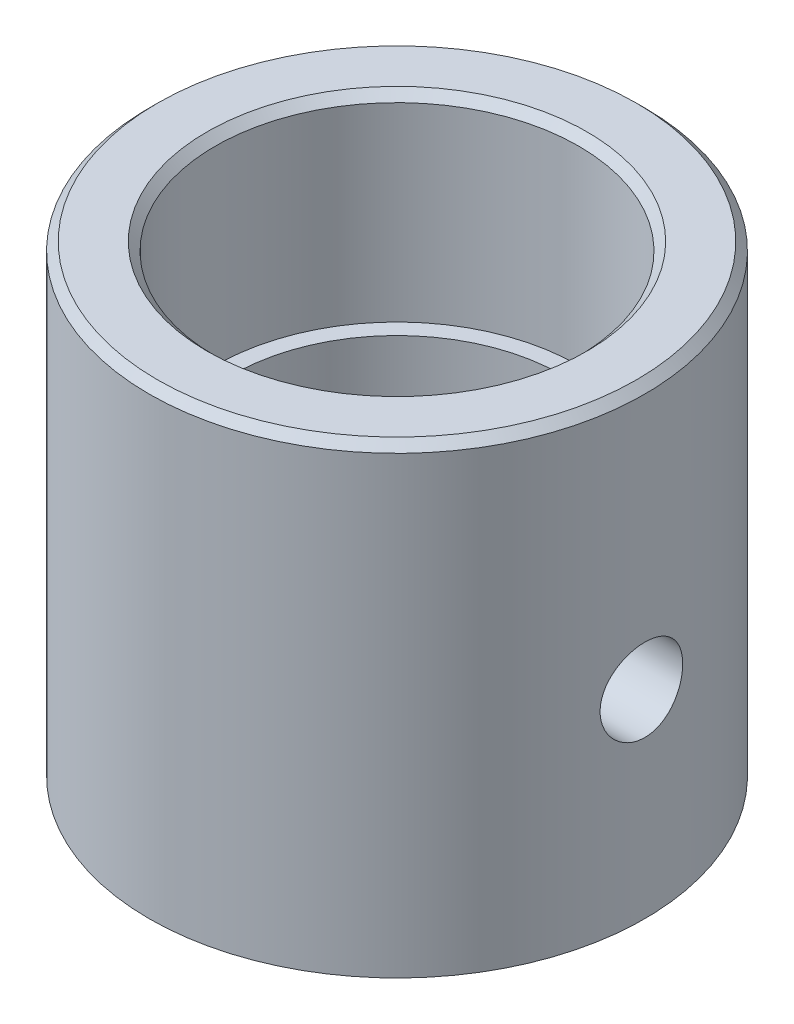
ISO-10303-21;
HEADER;
FILE_DESCRIPTION(('STEP AP214'),'2;1');
FILE_NAME('part.step','',(''),(''),'','','');
FILE_SCHEMA(('AUTOMOTIVE_DESIGN { 1 0 10303 214 1 1 1 1 }'));
ENDSEC;
DATA;
#1=APPLICATION_CONTEXT('core data for automotive mechanical design processes');
#2=APPLICATION_PROTOCOL_DEFINITION('international standard','automotive_design',2000,#1);
#3=PRODUCT_CONTEXT('',#1,'mechanical');
#4=PRODUCT('Part','Part','',(#3));
#5=PRODUCT_RELATED_PRODUCT_CATEGORY('part','',(#4));
#6=PRODUCT_DEFINITION_FORMATION('','',#4);
#7=PRODUCT_DEFINITION_CONTEXT('part definition',#1,'design');
#8=PRODUCT_DEFINITION('design','',#6,#7);
#9=PRODUCT_DEFINITION_SHAPE('','',#8);
#10=(LENGTH_UNIT() NAMED_UNIT(*) SI_UNIT(.MILLI.,.METRE.));
#11=(NAMED_UNIT(*) PLANE_ANGLE_UNIT() SI_UNIT($,.RADIAN.));
#12=(NAMED_UNIT(*) SI_UNIT($,.STERADIAN.) SOLID_ANGLE_UNIT());
#13=UNCERTAINTY_MEASURE_WITH_UNIT(LENGTH_MEASURE(1.E-05),#10,'distance_accuracy_value','');
#14=(GEOMETRIC_REPRESENTATION_CONTEXT(3) GLOBAL_UNCERTAINTY_ASSIGNED_CONTEXT((#13)) GLOBAL_UNIT_ASSIGNED_CONTEXT((#10,
#11,#12)) REPRESENTATION_CONTEXT('',''));
#15=CARTESIAN_POINT('',(0.,0.,0.));
#16=DIRECTION('',(0.,0.,1.));
#17=DIRECTION('',(1.,0.,0.));
#18=AXIS2_PLACEMENT_3D('',#15,#16,#17);
#19=CARTESIAN_POINT('',(0.,28.,0.));
#20=DIRECTION('',(0.,-1.,0.));
#21=DIRECTION('',(0.,0.,-1.));
#22=AXIS2_PLACEMENT_3D('',#19,#20,#21);
#23=CYLINDRICAL_SURFACE('',#22,15.);
#24=CARTESIAN_POINT('',(0.,27.5,0.));
#25=DIRECTION('',(0.,1.,0.));
#26=DIRECTION('',(0.,0.,1.));
#27=AXIS2_PLACEMENT_3D('',#24,#25,#26);
#28=CIRCLE('',#27,15.);
#29=CARTESIAN_POINT('',(0.,27.5,15.));
#30=VERTEX_POINT('',#29);
#31=EDGE_CURVE('E40',#30,#30,#28,.F.);
#32=ORIENTED_EDGE('',*,*,#31,.T.);
#33=EDGE_LOOP('',(#32));
#34=FACE_BOUND('',#33,.T.);
#35=CARTESIAN_POINT('',(-14.790199457749,12.,-2.5));
#36=CARTESIAN_POINT('',(-14.790201973666,12.1393757481618,-2.49999439841983));
#37=CARTESIAN_POINT('',(-14.7921909238523,12.2788276060715,-2.48830516902828));
#38=CARTESIAN_POINT('',(-14.7999245720004,12.5538185432632,-2.44187742806638));
#39=CARTESIAN_POINT('',(-14.8056727334637,12.6893538937581,-2.40711766030861));
#40=CARTESIAN_POINT('',(-14.8202560936731,12.9524922833416,-2.31562954367049));
#41=CARTESIAN_POINT('',(-14.8290887118401,13.0801018486622,-2.25891955493199));
#42=CARTESIAN_POINT('',(-14.8488427210228,13.3239809547178,-2.12518649688947));
#43=CARTESIAN_POINT('',(-14.8597638769423,13.4402517695773,-2.04816571350133));
#44=CARTESIAN_POINT('',(-14.8825847115588,13.6593128497446,-1.87518752696654));
#45=CARTESIAN_POINT('',(-14.8944921732795,13.7619751313862,-1.77906904893234));
#46=CARTESIAN_POINT('',(-14.9178748066858,13.9497933068618,-1.57097200469528));
#47=CARTESIAN_POINT('',(-14.9293499527174,14.0349481631154,-1.45899249914997));
#48=CARTESIAN_POINT('',(-14.9506573698271,14.1858145672193,-1.22152286994836));
#49=CARTESIAN_POINT('',(-14.9604794243234,14.2514070077318,-1.09595608145671));
#50=CARTESIAN_POINT('',(-14.9772873695709,14.3605210705306,-0.835395621723869));
#51=CARTESIAN_POINT('',(-14.9842734447266,14.4040441278849,-0.700402564078189));
#52=CARTESIAN_POINT('',(-14.994567347244,14.4673925349839,-0.426143726344243));
#53=CARTESIAN_POINT('',(-14.9979085311091,14.4874329160047,-0.286928886679271));
#54=CARTESIAN_POINT('',(-15.0006507934278,14.5039157541526,-0.00707528552579671));
#55=CARTESIAN_POINT('',(-15.0000521396931,14.5003598152472,0.133563378528899));
#56=CARTESIAN_POINT('',(-14.9950085843139,14.4699186484718,0.410802185078876));
#57=CARTESIAN_POINT('',(-14.990601836924,14.4432648365908,0.547428530700141));
#58=CARTESIAN_POINT('',(-14.9784797877164,14.3677489257535,0.814241979611791));
#59=CARTESIAN_POINT('',(-14.9707643851321,14.3188861504105,0.944428886651504));
#60=CARTESIAN_POINT('',(-14.9528269851196,14.2001093596847,1.19535614778265));
#61=CARTESIAN_POINT('',(-14.9425936732688,14.1300999879176,1.31605052301905));
#62=CARTESIAN_POINT('',(-14.920757380715,13.971087177365,1.54406552984664));
#63=CARTESIAN_POINT('',(-14.9091542891913,13.8820822012892,1.65138507791588));
#64=CARTESIAN_POINT('',(-14.885702682326,13.6863211933807,1.85097127344667));
#65=CARTESIAN_POINT('',(-14.8738528973104,13.579362905099,1.94303950225321));
#66=CARTESIAN_POINT('',(-14.8513795978481,13.3514129097842,2.10795458844807));
#67=CARTESIAN_POINT('',(-14.8407560947132,13.2304210733172,2.18080126853242));
#68=CARTESIAN_POINT('',(-14.8219375456182,12.9776083581225,2.30524443448829));
#69=CARTESIAN_POINT('',(-14.813745233026,12.8457755019079,2.35681702727924));
#70=CARTESIAN_POINT('',(-14.8007618868988,12.5751509276925,2.43702987081562));
#71=CARTESIAN_POINT('',(-14.7959705538832,12.4363598235676,2.46567214076796));
#72=CARTESIAN_POINT('',(-14.7903895942212,12.1575338438379,2.49893188487927));
#73=CARTESIAN_POINT('',(-14.7895528575867,12.0175336202979,2.50383220791244));
#74=CARTESIAN_POINT('',(-14.7918503478236,11.7387133283092,2.49022270268246));
#75=CARTESIAN_POINT('',(-14.7949844213185,11.599893214486,2.47171377862467));
#76=CARTESIAN_POINT('',(-14.8048268745502,11.3282722408091,2.4120523349281));
#77=CARTESIAN_POINT('',(-14.8115125191835,11.195438860122,2.37104379064639));
#78=CARTESIAN_POINT('',(-14.827685730055,10.9385298337205,2.26769819019228));
#79=CARTESIAN_POINT('',(-14.8371734639058,10.8144547124491,2.20535985810094));
#80=CARTESIAN_POINT('',(-14.8579912839739,10.5773254055939,2.06045667322923));
#81=CARTESIAN_POINT('',(-14.8693375560035,10.4643834272439,1.97771056415936));
#82=CARTESIAN_POINT('',(-14.8925466667987,10.253886467305,1.79458946570798));
#83=CARTESIAN_POINT('',(-14.9044095418533,10.1563325688903,1.69421323638404));
#84=CARTESIAN_POINT('',(-14.9274642211826,9.9783481072713,1.47742807032881));
#85=CARTESIAN_POINT('',(-14.9386477634467,9.89810617371546,1.3608632533862));
#86=CARTESIAN_POINT('',(-14.9589511243294,9.75834467299512,1.11574344794933));
#87=CARTESIAN_POINT('',(-14.9680710096998,9.69882443552615,0.987188847470627));
#88=CARTESIAN_POINT('',(-14.9831835816958,9.60248941604513,0.722299051501329));
#89=CARTESIAN_POINT('',(-14.9891898456762,9.56557592426508,0.586000562602612));
#90=CARTESIAN_POINT('',(-14.9974558316928,9.51518440103617,0.309030734874212));
#91=CARTESIAN_POINT('',(-14.9997158620019,9.50170444126765,0.168359756821621));
#92=CARTESIAN_POINT('',(-15.0002303788781,9.4986181176878,-0.111541275773676));
#93=CARTESIAN_POINT('',(-14.9985330202419,9.50872474605892,-0.250768160602664));
#94=CARTESIAN_POINT('',(-14.9914217838733,9.55190392226943,-0.525511974314705));
#95=CARTESIAN_POINT('',(-14.9860079269518,9.58497634150967,-0.661028923967479));
#96=CARTESIAN_POINT('',(-14.972069888274,9.67303816554365,-0.924396445918538));
#97=CARTESIAN_POINT('',(-14.9635491704088,9.72800316821005,-1.05225537215382));
#98=CARTESIAN_POINT('',(-14.9443275687803,9.85825793623058,-1.29698045298217));
#99=CARTESIAN_POINT('',(-14.9336265816741,9.93354866506245,-1.41384608611822));
#100=CARTESIAN_POINT('',(-14.9110762961641,10.1033350924605,-1.63471294552639));
#101=CARTESIAN_POINT('',(-14.8992152454112,10.1980409547513,-1.73855143060275));
#102=CARTESIAN_POINT('',(-14.8757630331437,10.4035283079038,-1.92896387595091));
#103=CARTESIAN_POINT('',(-14.8641719354951,10.5143135589125,-2.0155337867119));
#104=CARTESIAN_POINT('',(-14.8424834353391,10.7497453224896,-2.16951427091086));
#105=CARTESIAN_POINT('',(-14.8323971784578,10.8744843397655,-2.2367849890577));
#106=CARTESIAN_POINT('',(-14.8149921009131,11.1336092358381,-2.34931453640427));
#107=CARTESIAN_POINT('',(-14.8076705172488,11.2679853226774,-2.39459535522307));
#108=CARTESIAN_POINT('',(-14.7982474485649,11.5024037694874,-2.45202605312742));
#109=CARTESIAN_POINT('',(-14.7952462341947,11.6010268079626,-2.46998741767139));
#110=CARTESIAN_POINT('',(-14.7912213528807,11.7997534848369,-2.49397629518131));
#111=CARTESIAN_POINT('',(-14.7901976500369,11.8998570963242,-2.50000402479277));
#112=CARTESIAN_POINT('',(-14.790199457749,12.,-2.5));
#113=B_SPLINE_CURVE_WITH_KNOTS('',3,(#35,#36,#37,#38,#39,#40,#41,#42,#43,#44,#45,#46,#47,#48,
#49,#50,#51,#52,#53,#54,#55,#56,#57,#58,#59,#60,#61,#62,#63,#64,#65,#66,#67,#68,#69,#70,#71,#72,
#73,#74,#75,#76,#77,#78,#79,#80,#81,#82,#83,#84,#85,#86,#87,#88,#89,#90,#91,#92,#93,#94,#95,#96,
#97,#98,#99,#100,#101,#102,#103,#104,#105,#106,#107,#108,#109,#110,#111,#112),.UNSPECIFIED.,.T.,
.F.,(4,2,2,2,2,2,2,2,2,2,2,2,2,2,2,2,2,2,2,2,2,2,2,2,2,2,2,2,2,2,2,2,2,2,2,2,2,2,4),(0.,
0.41776103892774,0.83590751996297,1.25370499787519,1.67145547405274,2.09289159155714,
2.51435267834447,2.93832980111435,3.36227935111113,3.78231567472565,4.20232344652692,
4.61817121164669,5.03403164249533,5.45179604139425,5.86959426226764,6.29246123462124,
6.71533210746019,7.13867662498603,7.56198385938077,7.9802354242041,8.39847083413976,
8.81406064635492,9.22967532293575,9.64912342762702,10.0686010443069,10.4924411303538,
10.916267504767,11.3382298441765,11.7601574591235,12.1769777626592,12.5937957321882,
13.0101503983246,13.4265248039234,13.8476699746325,14.2689137888181,14.6931372761832,
15.1169356674445,15.4171067054377,15.7172722940182),.UNSPECIFIED.);
#114=CARTESIAN_POINT('',(-14.790199457749,12.,-2.5));
#115=VERTEX_POINT('',#114);
#116=EDGE_CURVE('E91',#115,#115,#113,.T.);
#117=ORIENTED_EDGE('',*,*,#116,.T.);
#118=EDGE_LOOP('',(#117));
#119=FACE_BOUND('',#118,.T.);
#120=CARTESIAN_POINT('',(14.790199457749,12.,-2.5));
#121=CARTESIAN_POINT('',(14.790201973666,11.8606242518382,-2.49999439841983));
#122=CARTESIAN_POINT('',(14.7921909238523,11.7211723939285,-2.48830516902828));
#123=CARTESIAN_POINT('',(14.7999245720004,11.4461814567368,-2.44187742806638));
#124=CARTESIAN_POINT('',(14.8056727334637,11.3106461062419,-2.40711766030861));
#125=CARTESIAN_POINT('',(14.8202560936731,11.0475077166584,-2.31562954367049));
#126=CARTESIAN_POINT('',(14.8290887118401,10.9198981513378,-2.25891955493199));
#127=CARTESIAN_POINT('',(14.8488427210228,10.6760190452822,-2.12518649688947));
#128=CARTESIAN_POINT('',(14.8597638769423,10.5597482304227,-2.04816571350133));
#129=CARTESIAN_POINT('',(14.8825847115588,10.3406871502554,-1.87518752696654));
#130=CARTESIAN_POINT('',(14.8944921732795,10.2380248686138,-1.77906904893234));
#131=CARTESIAN_POINT('',(14.9178748066858,10.0502066931382,-1.57097200469528));
#132=CARTESIAN_POINT('',(14.9293499527174,9.96505183688458,-1.45899249914997));
#133=CARTESIAN_POINT('',(14.9506573698271,9.81418543278073,-1.22152286994836));
#134=CARTESIAN_POINT('',(14.9604794243234,9.7485929922682,-1.09595608145671));
#135=CARTESIAN_POINT('',(14.9772873695709,9.63947892946945,-0.835395621723869));
#136=CARTESIAN_POINT('',(14.9842734447266,9.59595587211512,-0.700402564078189));
#137=CARTESIAN_POINT('',(14.994567347244,9.5326074650161,-0.426143726344243));
#138=CARTESIAN_POINT('',(14.9979085311091,9.51256708399531,-0.286928886679271));
#139=CARTESIAN_POINT('',(15.0006507934278,9.4960842458474,-0.00707528552579674));
#140=CARTESIAN_POINT('',(15.0000521396931,9.49964018475277,0.133563378528899));
#141=CARTESIAN_POINT('',(14.9950085843139,9.53008135152821,0.410802185078876));
#142=CARTESIAN_POINT('',(14.990601836924,9.55673516340915,0.547428530700141));
#143=CARTESIAN_POINT('',(14.9784797877164,9.63225107424649,0.814241979611791));
#144=CARTESIAN_POINT('',(14.9707643851321,9.6811138495895,0.944428886651504));
#145=CARTESIAN_POINT('',(14.9528269851196,9.79989064031532,1.19535614778265));
#146=CARTESIAN_POINT('',(14.9425936732688,9.86990001208244,1.31605052301905));
#147=CARTESIAN_POINT('',(14.920757380715,10.028912822635,1.54406552984664));
#148=CARTESIAN_POINT('',(14.9091542891913,10.1179177987108,1.65138507791588));
#149=CARTESIAN_POINT('',(14.885702682326,10.3136788066193,1.85097127344667));
#150=CARTESIAN_POINT('',(14.8738528973104,10.420637094901,1.94303950225321));
#151=CARTESIAN_POINT('',(14.8513795978481,10.6485870902158,2.10795458844806));
#152=CARTESIAN_POINT('',(14.8407560947132,10.7695789266828,2.18080126853242));
#153=CARTESIAN_POINT('',(14.8219375456182,11.0223916418775,2.30524443448829));
#154=CARTESIAN_POINT('',(14.813745233026,11.1542244980921,2.35681702727924));
#155=CARTESIAN_POINT('',(14.8007618868988,11.4248490723075,2.43702987081562));
#156=CARTESIAN_POINT('',(14.7959705538832,11.5636401764324,2.46567214076796));
#157=CARTESIAN_POINT('',(14.7903895942212,11.8424661561621,2.49893188487927));
#158=CARTESIAN_POINT('',(14.7895528575867,11.9824663797021,2.50383220791244));
#159=CARTESIAN_POINT('',(14.7918503478236,12.2612866716908,2.49022270268246));
#160=CARTESIAN_POINT('',(14.7949844213185,12.400106785514,2.47171377862467));
#161=CARTESIAN_POINT('',(14.8048268745502,12.6717277591909,2.4120523349281));
#162=CARTESIAN_POINT('',(14.8115125191835,12.804561139878,2.37104379064639));
#163=CARTESIAN_POINT('',(14.827685730055,13.0614701662795,2.26769819019228));
#164=CARTESIAN_POINT('',(14.8371734639058,13.1855452875509,2.20535985810094));
#165=CARTESIAN_POINT('',(14.8579912839739,13.4226745944061,2.06045667322923));
#166=CARTESIAN_POINT('',(14.8693375560035,13.5356165727561,1.97771056415936));
#167=CARTESIAN_POINT('',(14.8925466667987,13.746113532695,1.79458946570798));
#168=CARTESIAN_POINT('',(14.9044095418533,13.8436674311097,1.69421323638404));
#169=CARTESIAN_POINT('',(14.9274642211826,14.0216518927287,1.47742807032881));
#170=CARTESIAN_POINT('',(14.9386477634467,14.1018938262845,1.3608632533862));
#171=CARTESIAN_POINT('',(14.9589511243294,14.2416553270049,1.11574344794933));
#172=CARTESIAN_POINT('',(14.9680710096998,14.3011755644739,0.987188847470627));
#173=CARTESIAN_POINT('',(14.9831835816958,14.3975105839549,0.722299051501329));
#174=CARTESIAN_POINT('',(14.9891898456762,14.4344240757349,0.586000562602612));
#175=CARTESIAN_POINT('',(14.9974558316928,14.4848155989638,0.309030734874212));
#176=CARTESIAN_POINT('',(14.9997158620019,14.4982955587324,0.168359756821621));
#177=CARTESIAN_POINT('',(15.0002303788781,14.5013818823122,-0.111541275773676));
#178=CARTESIAN_POINT('',(14.9985330202419,14.4912752539411,-0.250768160602664));
#179=CARTESIAN_POINT('',(14.9914217838733,14.4480960777306,-0.525511974314705));
#180=CARTESIAN_POINT('',(14.9860079269518,14.4150236584903,-0.661028923967479));
#181=CARTESIAN_POINT('',(14.972069888274,14.3269618344563,-0.924396445918538));
#182=CARTESIAN_POINT('',(14.9635491704088,14.27199683179,-1.05225537215382));
#183=CARTESIAN_POINT('',(14.9443275687803,14.1417420637694,-1.29698045298217));
#184=CARTESIAN_POINT('',(14.9336265816741,14.0664513349376,-1.41384608611822));
#185=CARTESIAN_POINT('',(14.9110762961641,13.8966649075395,-1.63471294552639));
#186=CARTESIAN_POINT('',(14.8992152454112,13.8019590452487,-1.73855143060275));
#187=CARTESIAN_POINT('',(14.8757630331437,13.5964716920962,-1.92896387595091));
#188=CARTESIAN_POINT('',(14.8641719354951,13.4856864410875,-2.0155337867119));
#189=CARTESIAN_POINT('',(14.8424834353391,13.2502546775104,-2.16951427091086));
#190=CARTESIAN_POINT('',(14.8323971784578,13.1255156602345,-2.2367849890577));
#191=CARTESIAN_POINT('',(14.8149921009131,12.8663907641619,-2.34931453640427));
#192=CARTESIAN_POINT('',(14.8076705172488,12.7320146773226,-2.39459535522307));
#193=CARTESIAN_POINT('',(14.7982474485649,12.4975962305126,-2.45202605312742));
#194=CARTESIAN_POINT('',(14.7952462341947,12.3989731920374,-2.46998741767139));
#195=CARTESIAN_POINT('',(14.7912213528807,12.2002465151631,-2.49397629518131));
#196=CARTESIAN_POINT('',(14.7901976500369,12.1001429036758,-2.50000402479277));
#197=CARTESIAN_POINT('',(14.790199457749,12.,-2.5));
#198=B_SPLINE_CURVE_WITH_KNOTS('',3,(#120,#121,#122,#123,#124,#125,#126,#127,#128,#129,#130,
#131,#132,#133,#134,#135,#136,#137,#138,#139,#140,#141,#142,#143,#144,#145,#146,#147,#148,#149,
#150,#151,#152,#153,#154,#155,#156,#157,#158,#159,#160,#161,#162,#163,#164,#165,#166,#167,#168,
#169,#170,#171,#172,#173,#174,#175,#176,#177,#178,#179,#180,#181,#182,#183,#184,#185,#186,#187,
#188,#189,#190,#191,#192,#193,#194,#195,#196,#197),.UNSPECIFIED.,.T.,.F.,(4,2,2,2,2,2,2,2,2,2,2,
2,2,2,2,2,2,2,2,2,2,2,2,2,2,2,2,2,2,2,2,2,2,2,2,2,2,2,4),(0.,0.41776103892774,0.83590751996297,
1.25370499787519,1.67145547405274,2.09289159155714,2.51435267834447,2.93832980111435,
3.36227935111113,3.78231567472565,4.20232344652692,4.61817121164668,5.03403164249533,
5.45179604139425,5.86959426226764,6.29246123462123,6.71533210746019,7.13867662498604,
7.56198385938077,7.9802354242041,8.39847083413976,8.81406064635492,9.22967532293575,
9.64912342762702,10.0686010443069,10.4924411303538,10.916267504767,11.3382298441765,
11.7601574591235,12.1769777626592,12.5937957321882,13.0101503983246,13.4265248039234,
13.8476699746325,14.2689137888181,14.6931372761832,15.1169356674445,15.4171067054377,
15.7172722940182),.UNSPECIFIED.);
#199=CARTESIAN_POINT('',(14.790199457749,12.,-2.5));
#200=VERTEX_POINT('',#199);
#201=EDGE_CURVE('E62',#200,#200,#198,.T.);
#202=ORIENTED_EDGE('',*,*,#201,.T.);
#203=EDGE_LOOP('',(#202));
#204=FACE_BOUND('',#203,.T.);
#205=CARTESIAN_POINT('',(0.,0.,0.));
#206=DIRECTION('',(0.,1.,0.));
#207=DIRECTION('',(0.,0.,1.));
#208=AXIS2_PLACEMENT_3D('',#205,#206,#207);
#209=CIRCLE('',#208,15.);
#210=CARTESIAN_POINT('',(0.,0.,15.));
#211=VERTEX_POINT('',#210);
#212=EDGE_CURVE('E53',#211,#211,#209,.T.);
#213=ORIENTED_EDGE('',*,*,#212,.T.);
#214=EDGE_LOOP('',(#213));
#215=FACE_BOUND('',#214,.T.);
#216=ADVANCED_FACE('F32',(#34,#119,#204,#215),#23,.T.);
#217=CARTESIAN_POINT('',(0.,28.,0.));
#218=DIRECTION('',(0.,1.,0.));
#219=DIRECTION('',(0.,0.,1.));
#220=AXIS2_PLACEMENT_3D('',#217,#218,#219);
#221=PLANE('',#220);
#222=CARTESIAN_POINT('',(0.,28.,0.));
#223=DIRECTION('',(0.,1.,0.));
#224=DIRECTION('',(0.,0.,1.));
#225=AXIS2_PLACEMENT_3D('',#222,#223,#224);
#226=CIRCLE('',#225,14.5);
#227=CARTESIAN_POINT('',(0.,28.,14.5));
#228=VERTEX_POINT('',#227);
#229=EDGE_CURVE('E44',#228,#228,#226,.T.);
#230=ORIENTED_EDGE('',*,*,#229,.T.);
#231=EDGE_LOOP('',(#230));
#232=FACE_BOUND('',#231,.T.);
#233=CARTESIAN_POINT('',(0.,28.,0.));
#234=DIRECTION('',(0.,1.,0.));
#235=DIRECTION('',(0.,0.,1.));
#236=AXIS2_PLACEMENT_3D('',#233,#234,#235);
#237=CIRCLE('',#236,11.5);
#238=CARTESIAN_POINT('',(0.,28.,11.5));
#239=VERTEX_POINT('',#238);
#240=EDGE_CURVE('E48',#239,#239,#237,.F.);
#241=ORIENTED_EDGE('',*,*,#240,.T.);
#242=EDGE_LOOP('',(#241));
#243=FACE_BOUND('',#242,.T.);
#244=ADVANCED_FACE('F99',(#232,#243),#221,.T.);
#245=CARTESIAN_POINT('',(0.,0.,0.));
#246=DIRECTION('',(0.,1.,0.));
#247=DIRECTION('',(0.,0.,1.));
#248=AXIS2_PLACEMENT_3D('',#245,#246,#247);
#249=PLANE('',#248);
#250=ORIENTED_EDGE('',*,*,#212,.F.);
#251=EDGE_LOOP('',(#250));
#252=FACE_BOUND('',#251,.T.);
#253=ADVANCED_FACE('F100',(#252),#249,.F.);
#254=CARTESIAN_POINT('',(0.,16.,0.));
#255=DIRECTION('',(0.,1.,0.));
#256=DIRECTION('',(0.,0.,1.));
#257=AXIS2_PLACEMENT_3D('',#254,#255,#256);
#258=PLANE('',#257);
#259=CARTESIAN_POINT('',(0.,16.,0.));
#260=DIRECTION('',(0.,1.,0.));
#261=DIRECTION('',(0.,0.,1.));
#262=AXIS2_PLACEMENT_3D('',#259,#260,#261);
#263=CIRCLE('',#262,11.);
#264=CARTESIAN_POINT('',(0.,16.,11.));
#265=VERTEX_POINT('',#264);
#266=EDGE_CURVE('E136',#265,#265,#263,.T.);
#267=ORIENTED_EDGE('',*,*,#266,.T.);
#268=EDGE_LOOP('',(#267));
#269=FACE_BOUND('',#268,.T.);
#270=CARTESIAN_POINT('',(0.,16.,0.));
#271=DIRECTION('',(0.,1.,0.));
#272=DIRECTION('',(0.,0.,1.));
#273=AXIS2_PLACEMENT_3D('',#270,#271,#272);
#274=CIRCLE('',#273,10.);
#275=CARTESIAN_POINT('',(0.,16.,10.));
#276=VERTEX_POINT('',#275);
#277=EDGE_CURVE('E133',#276,#276,#274,.F.);
#278=ORIENTED_EDGE('',*,*,#277,.T.);
#279=EDGE_LOOP('',(#278));
#280=FACE_BOUND('',#279,.T.);
#281=ADVANCED_FACE('F79',(#269,#280),#258,.T.);
#282=CARTESIAN_POINT('',(0.,16.,0.));
#283=DIRECTION('',(0.,1.,0.));
#284=DIRECTION('',(0.,0.,1.));
#285=AXIS2_PLACEMENT_3D('',#282,#283,#284);
#286=CYLINDRICAL_SURFACE('',#285,11.);
#287=CARTESIAN_POINT('',(0.,27.5,0.));
#288=DIRECTION('',(0.,1.,0.));
#289=DIRECTION('',(0.,0.,1.));
#290=AXIS2_PLACEMENT_3D('',#287,#288,#289);
#291=CIRCLE('',#290,11.);
#292=CARTESIAN_POINT('',(0.,27.5,11.));
#293=VERTEX_POINT('',#292);
#294=EDGE_CURVE('E10',#293,#293,#291,.T.);
#295=ORIENTED_EDGE('',*,*,#294,.T.);
#296=EDGE_LOOP('',(#295));
#297=FACE_BOUND('',#296,.T.);
#298=ORIENTED_EDGE('',*,*,#266,.F.);
#299=EDGE_LOOP('',(#298));
#300=FACE_BOUND('',#299,.T.);
#301=ADVANCED_FACE('F125',(#297,#300),#286,.F.);
#302=CARTESIAN_POINT('',(0.,1.,0.));
#303=DIRECTION('',(0.,1.,0.));
#304=DIRECTION('',(0.,0.,1.));
#305=AXIS2_PLACEMENT_3D('',#302,#303,#304);
#306=PLANE('',#305);
#307=CARTESIAN_POINT('',(0.,1.,0.));
#308=DIRECTION('',(0.,1.,0.));
#309=DIRECTION('',(0.,0.,1.));
#310=AXIS2_PLACEMENT_3D('',#307,#308,#309);
#311=CIRCLE('',#310,10.);
#312=CARTESIAN_POINT('',(0.,1.,10.));
#313=VERTEX_POINT('',#312);
#314=EDGE_CURVE('E130',#313,#313,#311,.T.);
#315=ORIENTED_EDGE('',*,*,#314,.T.);
#316=EDGE_LOOP('',(#315));
#317=FACE_BOUND('',#316,.T.);
#318=ADVANCED_FACE('F153',(#317),#306,.T.);
#319=CARTESIAN_POINT('',(0.,1.,0.));
#320=DIRECTION('',(0.,1.,0.));
#321=DIRECTION('',(0.,0.,1.));
#322=AXIS2_PLACEMENT_3D('',#319,#320,#321);
#323=CYLINDRICAL_SURFACE('',#322,10.);
#324=CARTESIAN_POINT('',(-9.68245836551854,12.,-2.5));
#325=CARTESIAN_POINT('',(-9.6824610008786,11.8619492490734,-2.49999607859307));
#326=CARTESIAN_POINT('',(-9.68544306014597,11.7238551013215,-2.48852624549765));
#327=CARTESIAN_POINT('',(-9.69701861992564,11.4516324218265,-2.44302312546379));
#328=CARTESIAN_POINT('',(-9.7056153862163,11.3175062455318,-2.4089767067421));
#329=CARTESIAN_POINT('',(-9.7273872459615,11.0571964618128,-2.31949119963204));
#330=CARTESIAN_POINT('',(-9.74055642690458,10.9310028446143,-2.26407972785449));
#331=CARTESIAN_POINT('',(-9.76998192028759,10.6896891474601,-2.13352114126138));
#332=CARTESIAN_POINT('',(-9.78623836378489,10.5745695379198,-2.05837318856068));
#333=CARTESIAN_POINT('',(-9.82040716355625,10.3561383547378,-1.88870842731188));
#334=CARTESIAN_POINT('',(-9.83834597623034,10.25310639965,-1.79383688770405));
#335=CARTESIAN_POINT('',(-9.87362875515294,10.0642386056397,-1.58818206410066));
#336=CARTESIAN_POINT('',(-9.89097266566388,9.97840437437825,-1.47739729418031));
#337=CARTESIAN_POINT('',(-9.92340415520582,9.82522453236872,-1.24114520107895));
#338=CARTESIAN_POINT('',(-9.93845687400592,9.75815361183853,-1.11549457619512));
#339=CARTESIAN_POINT('',(-9.96430811925984,9.64619035584692,-0.854263184292763));
#340=CARTESIAN_POINT('',(-9.97510727334345,9.60129474808449,-0.718683885791941));
#341=CARTESIAN_POINT('',(-9.9910475884818,9.53585216542142,-0.444358758754163));
#342=CARTESIAN_POINT('',(-9.99629893844314,9.51483035567342,-0.305732719548977));
#343=CARTESIAN_POINT('',(-10.000935941073,9.49624162072445,-0.0268288192627705));
#344=CARTESIAN_POINT('',(-10.000322460967,9.4986712277904,0.113448794538067));
#345=CARTESIAN_POINT('',(-9.99338094953534,9.52657485025014,0.388380617930967));
#346=CARTESIAN_POINT('',(-9.98718002340871,9.55153632505386,0.523090539002667));
#347=CARTESIAN_POINT('',(-9.96990836524857,9.6229712700485,0.786345618534215));
#348=CARTESIAN_POINT('',(-9.95883737398452,9.66944588537741,0.914890448426095));
#349=CARTESIAN_POINT('',(-9.93287509700884,9.78300257068706,1.16351675875452));
#350=CARTESIAN_POINT('',(-9.91795019695011,9.85026704466174,1.28351127441626));
#351=CARTESIAN_POINT('',(-9.88589903809692,10.0033556791163,1.51068905585122));
#352=CARTESIAN_POINT('',(-9.8687723965265,10.0891830685606,1.61787008771376));
#353=CARTESIAN_POINT('',(-9.83363713769356,10.2797087419824,1.81943508771239));
#354=CARTESIAN_POINT('',(-9.81561719525297,10.3848548923477,1.91339419768799));
#355=CARTESIAN_POINT('',(-9.78115043517327,10.6095999735403,2.08244093990755));
#356=CARTESIAN_POINT('',(-9.76470369108289,10.7291995794911,2.15752769011507));
#357=CARTESIAN_POINT('',(-9.73520496829319,10.9802900341489,2.28697032255647));
#358=CARTESIAN_POINT('',(-9.72216983717007,11.1118357303128,2.34122391742612));
#359=CARTESIAN_POINT('',(-9.70118640148669,11.3825854680768,2.42671405159095));
#360=CARTESIAN_POINT('',(-9.69323700842733,11.5217878639846,2.45795551638266));
#361=CARTESIAN_POINT('',(-9.68355356007457,11.7999595015299,2.49582963866592));
#362=CARTESIAN_POINT('',(-9.68166088976933,11.938837793341,2.50309047391912));
#363=CARTESIAN_POINT('',(-9.68387343364692,12.2158219365853,2.49451699051516));
#364=CARTESIAN_POINT('',(-9.687978095703,12.3539278579494,2.4786847978498));
#365=CARTESIAN_POINT('',(-9.7015708198498,12.6231142649486,2.42492546393825));
#366=CARTESIAN_POINT('',(-9.71096970242532,12.7542727265692,2.3873640682819));
#367=CARTESIAN_POINT('',(-9.73400718262805,13.0084314578533,2.29161808167046));
#368=CARTESIAN_POINT('',(-9.74764628246408,13.1314307590558,2.2334310477125));
#369=CARTESIAN_POINT('',(-9.77796137095511,13.3684412778669,2.0967706679366));
#370=CARTESIAN_POINT('',(-9.79469168607245,13.482228840043,2.01792175383564));
#371=CARTESIAN_POINT('',(-9.82917083071113,13.6951883628015,1.84265073233613));
#372=CARTESIAN_POINT('',(-9.84691982728307,13.7943579166501,1.7462257370136));
#373=CARTESIAN_POINT('',(-9.88197403031774,13.9778110425709,1.53565680246182));
#374=CARTESIAN_POINT('',(-9.8992570206188,14.0616600625488,1.42112988132898));
#375=CARTESIAN_POINT('',(-9.93097216613689,14.2089358669513,1.17925670673669));
#376=CARTESIAN_POINT('',(-9.94540447003949,14.2723637166082,1.05191112239398));
#377=CARTESIAN_POINT('',(-9.96970115738325,14.3764460345279,0.788895504327728));
#378=CARTESIAN_POINT('',(-9.97959830022409,14.4172642843791,0.653293452569706));
#379=CARTESIAN_POINT('',(-9.99385293395789,14.4754603346084,0.376874400797018));
#380=CARTESIAN_POINT('',(-9.99821149393422,14.492842658739,0.236058412603102));
#381=CARTESIAN_POINT('',(-10.0008542352202,14.5034189739388,-0.0427088161083059));
#382=CARTESIAN_POINT('',(-9.99929947199971,14.4972542727385,-0.180634567415052));
#383=CARTESIAN_POINT('',(-9.99064741143608,14.4623804317641,-0.453418741036875));
#384=CARTESIAN_POINT('',(-9.98355027892922,14.4336719624671,-0.58827725445232));
#385=CARTESIAN_POINT('',(-9.96463582134723,14.3548694505728,-0.850427589111934));
#386=CARTESIAN_POINT('',(-9.95284411255981,14.3048913667141,-0.977756236452156));
#387=CARTESIAN_POINT('',(-9.92578222284145,14.1850735524511,-1.22229263260406));
#388=CARTESIAN_POINT('',(-9.91051160346894,14.1152313183238,-1.33949910316408));
#389=CARTESIAN_POINT('',(-9.87768124200718,13.9557119150097,-1.56350482105826));
#390=CARTESIAN_POINT('',(-9.86007542354161,13.8655996427404,-1.66998747074584));
#391=CARTESIAN_POINT('',(-9.82476622642974,13.6689428700566,-1.86653755068376));
#392=CARTESIAN_POINT('',(-9.80706282418256,13.5623942097221,-1.95660081269147));
#393=CARTESIAN_POINT('',(-9.77318689613756,13.3334964645264,-2.11940506617958));
#394=CARTESIAN_POINT('',(-9.75704909183222,13.2108896915869,-2.19179154854095));
#395=CARTESIAN_POINT('',(-9.7285988873707,12.954861275313,-2.31481724146367));
#396=CARTESIAN_POINT('',(-9.71628370583034,12.8214475847654,-2.36547227438038));
#397=CARTESIAN_POINT('',(-9.69879771876843,12.5735574704121,-2.43605632142751));
#398=CARTESIAN_POINT('',(-9.69271657508747,12.4602670890347,-2.4599829264922));
#399=CARTESIAN_POINT('',(-9.6845459645655,12.2313278275058,-2.49195573142942));
#400=CARTESIAN_POINT('',(-9.68245615722769,12.115679149389,-2.50000328592938));
#401=CARTESIAN_POINT('',(-9.68245836551854,12.,-2.5));
#402=B_SPLINE_CURVE_WITH_KNOTS('',3,(#324,#325,#326,#327,#328,#329,#330,#331,#332,#333,#334,
#335,#336,#337,#338,#339,#340,#341,#342,#343,#344,#345,#346,#347,#348,#349,#350,#351,#352,#353,
#354,#355,#356,#357,#358,#359,#360,#361,#362,#363,#364,#365,#366,#367,#368,#369,#370,#371,#372,
#373,#374,#375,#376,#377,#378,#379,#380,#381,#382,#383,#384,#385,#386,#387,#388,#389,#390,#391,
#392,#393,#394,#395,#396,#397,#398,#399,#400,#401),.UNSPECIFIED.,.T.,.F.,(4,2,2,2,2,2,2,2,2,2,2,
2,2,2,2,2,2,2,2,2,2,2,2,2,2,2,2,2,2,2,2,2,2,2,2,2,2,2,4),(0.,0.413727441736135,
0.827695741428666,1.24113072716602,1.65458326755479,2.07623954192976,2.49793521479867,
2.9255149639792,3.35303159847092,3.77188750995346,4.1906814866602,4.60018262688947,
5.00970556724786,5.42292874254445,5.83622385468913,6.26070466571911,6.68520531199802,
7.11176432008402,7.53823200129548,7.95343574764204,8.36860127188747,8.77697405014152,
9.18539521426363,9.60182845864102,10.0183301888999,10.4452533097026,10.872154157245,
11.2959207281187,11.7196054891398,12.131834461324,12.5440511738193,12.9540487656466,
13.3640980574302,13.7839709658702,14.2039503157045,14.6317647729113,15.0592672137501,
15.4059782718572,15.7526597510792),.UNSPECIFIED.);
#403=CARTESIAN_POINT('',(-9.68245836551854,12.,-2.5));
#404=VERTEX_POINT('',#403);
#405=EDGE_CURVE('E54',#404,#404,#402,.T.);
#406=ORIENTED_EDGE('',*,*,#405,.T.);
#407=EDGE_LOOP('',(#406));
#408=FACE_BOUND('',#407,.T.);
#409=CARTESIAN_POINT('',(9.68245836551854,12.,-2.5));
#410=CARTESIAN_POINT('',(9.6824610008786,12.1380507509266,-2.49999607859307));
#411=CARTESIAN_POINT('',(9.68544306014597,12.2761448986785,-2.48852624549765));
#412=CARTESIAN_POINT('',(9.69701861992564,12.5483675781735,-2.44302312546379));
#413=CARTESIAN_POINT('',(9.7056153862163,12.6824937544682,-2.40897670674211));
#414=CARTESIAN_POINT('',(9.7273872459615,12.9428035381872,-2.31949119963204));
#415=CARTESIAN_POINT('',(9.74055642690458,13.0689971553857,-2.26407972785449));
#416=CARTESIAN_POINT('',(9.76998192028759,13.3103108525399,-2.13352114126138));
#417=CARTESIAN_POINT('',(9.78623836378489,13.4254304620802,-2.05837318856069));
#418=CARTESIAN_POINT('',(9.82040716355625,13.6438616452622,-1.88870842731188));
#419=CARTESIAN_POINT('',(9.83834597623034,13.74689360035,-1.79383688770405));
#420=CARTESIAN_POINT('',(9.87362875515294,13.9357613943603,-1.58818206410066));
#421=CARTESIAN_POINT('',(9.89097266566388,14.0215956256217,-1.47739729418031));
#422=CARTESIAN_POINT('',(9.92340415520582,14.1747754676313,-1.24114520107895));
#423=CARTESIAN_POINT('',(9.93845687400592,14.2418463881615,-1.11549457619512));
#424=CARTESIAN_POINT('',(9.96430811925984,14.3538096441531,-0.854263184292763));
#425=CARTESIAN_POINT('',(9.97510727334345,14.3987052519155,-0.718683885791941));
#426=CARTESIAN_POINT('',(9.9910475884818,14.4641478345786,-0.444358758754163));
#427=CARTESIAN_POINT('',(9.99629893844314,14.4851696443266,-0.305732719548977));
#428=CARTESIAN_POINT('',(10.000935941073,14.5037583792756,-0.0268288192627707));
#429=CARTESIAN_POINT('',(10.000322460967,14.5013287722096,0.113448794538067));
#430=CARTESIAN_POINT('',(9.99338094953534,14.4734251497499,0.388380617930967));
#431=CARTESIAN_POINT('',(9.98718002340871,14.4484636749461,0.523090539002667));
#432=CARTESIAN_POINT('',(9.96990836524857,14.3770287299515,0.786345618534215));
#433=CARTESIAN_POINT('',(9.95883737398452,14.3305541146226,0.914890448426095));
#434=CARTESIAN_POINT('',(9.93287509700884,14.2169974293129,1.16351675875452));
#435=CARTESIAN_POINT('',(9.91795019695011,14.1497329553383,1.28351127441626));
#436=CARTESIAN_POINT('',(9.88589903809692,13.9966443208837,1.51068905585122));
#437=CARTESIAN_POINT('',(9.8687723965265,13.9108169314394,1.61787008771376));
#438=CARTESIAN_POINT('',(9.83363713769356,13.7202912580176,1.81943508771239));
#439=CARTESIAN_POINT('',(9.81561719525297,13.6151451076523,1.91339419768799));
#440=CARTESIAN_POINT('',(9.78115043517327,13.3904000264597,2.08244093990755));
#441=CARTESIAN_POINT('',(9.76470369108289,13.2708004205089,2.15752769011507));
#442=CARTESIAN_POINT('',(9.73520496829319,13.0197099658511,2.28697032255647));
#443=CARTESIAN_POINT('',(9.72216983717007,12.8881642696872,2.34122391742612));
#444=CARTESIAN_POINT('',(9.70118640148669,12.6174145319232,2.42671405159095));
#445=CARTESIAN_POINT('',(9.69323700842733,12.4782121360154,2.45795551638266));
#446=CARTESIAN_POINT('',(9.68355356007457,12.2000404984701,2.49582963866592));
#447=CARTESIAN_POINT('',(9.68166088976933,12.061162206659,2.50309047391912));
#448=CARTESIAN_POINT('',(9.68387343364692,11.7841780634147,2.49451699051516));
#449=CARTESIAN_POINT('',(9.687978095703,11.6460721420506,2.4786847978498));
#450=CARTESIAN_POINT('',(9.7015708198498,11.3768857350514,2.42492546393825));
#451=CARTESIAN_POINT('',(9.71096970242532,11.2457272734308,2.3873640682819));
#452=CARTESIAN_POINT('',(9.73400718262805,10.9915685421467,2.29161808167046));
#453=CARTESIAN_POINT('',(9.74764628246408,10.8685692409442,2.2334310477125));
#454=CARTESIAN_POINT('',(9.77796137095511,10.6315587221331,2.0967706679366));
#455=CARTESIAN_POINT('',(9.79469168607245,10.517771159957,2.01792175383564));
#456=CARTESIAN_POINT('',(9.82917083071113,10.3048116371985,1.84265073233613));
#457=CARTESIAN_POINT('',(9.84691982728307,10.2056420833499,1.7462257370136));
#458=CARTESIAN_POINT('',(9.88197403031774,10.0221889574291,1.53565680246182));
#459=CARTESIAN_POINT('',(9.8992570206188,9.9383399374512,1.42112988132898));
#460=CARTESIAN_POINT('',(9.93097216613689,9.79106413304875,1.17925670673669));
#461=CARTESIAN_POINT('',(9.94540447003949,9.72763628339179,1.05191112239398));
#462=CARTESIAN_POINT('',(9.96970115738325,9.62355396547207,0.788895504327728));
#463=CARTESIAN_POINT('',(9.97959830022409,9.58273571562094,0.653293452569706));
#464=CARTESIAN_POINT('',(9.99385293395789,9.52453966539159,0.376874400797018));
#465=CARTESIAN_POINT('',(9.99821149393422,9.50715734126096,0.236058412603102));
#466=CARTESIAN_POINT('',(10.0008542352202,9.49658102606115,-0.0427088161083059));
#467=CARTESIAN_POINT('',(9.99929947199971,9.50274572726148,-0.180634567415052));
#468=CARTESIAN_POINT('',(9.99064741143608,9.53761956823587,-0.453418741036875));
#469=CARTESIAN_POINT('',(9.98355027892922,9.56632803753292,-0.58827725445232));
#470=CARTESIAN_POINT('',(9.96463582134723,9.64513054942715,-0.850427589111934));
#471=CARTESIAN_POINT('',(9.95284411255981,9.69510863328595,-0.977756236452157));
#472=CARTESIAN_POINT('',(9.92578222284145,9.81492644754893,-1.22229263260406));
#473=CARTESIAN_POINT('',(9.91051160346894,9.88476868167621,-1.33949910316408));
#474=CARTESIAN_POINT('',(9.87768124200718,10.0442880849903,-1.56350482105826));
#475=CARTESIAN_POINT('',(9.86007542354161,10.1344003572596,-1.66998747074584));
#476=CARTESIAN_POINT('',(9.82476622642974,10.3310571299434,-1.86653755068376));
#477=CARTESIAN_POINT('',(9.80706282418256,10.4376057902779,-1.95660081269148));
#478=CARTESIAN_POINT('',(9.77318689613756,10.6665035354736,-2.11940506617958));
#479=CARTESIAN_POINT('',(9.75704909183222,10.7891103084131,-2.19179154854095));
#480=CARTESIAN_POINT('',(9.7285988873707,11.045138724687,-2.31481724146367));
#481=CARTESIAN_POINT('',(9.71628370583034,11.1785524152346,-2.36547227438038));
#482=CARTESIAN_POINT('',(9.69879771876843,11.4264425295879,-2.43605632142751));
#483=CARTESIAN_POINT('',(9.69271657508747,11.5397329109653,-2.4599829264922));
#484=CARTESIAN_POINT('',(9.6845459645655,11.7686721724942,-2.49195573142942));
#485=CARTESIAN_POINT('',(9.68245615722769,11.884320850611,-2.50000328592938));
#486=CARTESIAN_POINT('',(9.68245836551854,12.,-2.5));
#487=B_SPLINE_CURVE_WITH_KNOTS('',3,(#409,#410,#411,#412,#413,#414,#415,#416,#417,#418,#419,
#420,#421,#422,#423,#424,#425,#426,#427,#428,#429,#430,#431,#432,#433,#434,#435,#436,#437,#438,
#439,#440,#441,#442,#443,#444,#445,#446,#447,#448,#449,#450,#451,#452,#453,#454,#455,#456,#457,
#458,#459,#460,#461,#462,#463,#464,#465,#466,#467,#468,#469,#470,#471,#472,#473,#474,#475,#476,
#477,#478,#479,#480,#481,#482,#483,#484,#485,#486),.UNSPECIFIED.,.T.,.F.,(4,2,2,2,2,2,2,2,2,2,2,
2,2,2,2,2,2,2,2,2,2,2,2,2,2,2,2,2,2,2,2,2,2,2,2,2,2,2,4),(0.,0.413727441736135,
0.827695741428666,1.24113072716602,1.65458326755479,2.07623954192976,2.49793521479867,
2.9255149639792,3.35303159847092,3.77188750995346,4.1906814866602,4.60018262688947,
5.00970556724786,5.42292874254445,5.83622385468913,6.26070466571912,6.68520531199802,
7.11176432008402,7.53823200129548,7.95343574764204,8.36860127188747,8.77697405014152,
9.18539521426363,9.60182845864102,10.0183301888999,10.4452533097026,10.872154157245,
11.2959207281187,11.7196054891398,12.131834461324,12.5440511738193,12.9540487656466,
13.3640980574302,13.7839709658702,14.2039503157045,14.6317647729113,15.0592672137501,
15.4059782718572,15.7526597510792),.UNSPECIFIED.);
#488=CARTESIAN_POINT('',(9.68245836551854,12.,-2.5));
#489=VERTEX_POINT('',#488);
#490=EDGE_CURVE('E63',#489,#489,#487,.T.);
#491=ORIENTED_EDGE('',*,*,#490,.T.);
#492=EDGE_LOOP('',(#491));
#493=FACE_BOUND('',#492,.T.);
#494=ORIENTED_EDGE('',*,*,#314,.F.);
#495=EDGE_LOOP('',(#494));
#496=FACE_BOUND('',#495,.T.);
#497=ORIENTED_EDGE('',*,*,#277,.F.);
#498=EDGE_LOOP('',(#497));
#499=FACE_BOUND('',#498,.T.);
#500=ADVANCED_FACE('F68',(#408,#493,#496,#499),#323,.F.);
#501=CARTESIAN_POINT('',(-31.,12.,0.));
#502=DIRECTION('',(1.,0.,0.));
#503=DIRECTION('',(0.,0.,-1.));
#504=AXIS2_PLACEMENT_3D('',#501,#502,#503);
#505=CYLINDRICAL_SURFACE('',#504,2.5);
#506=ORIENTED_EDGE('',*,*,#490,.F.);
#507=EDGE_LOOP('',(#506));
#508=FACE_BOUND('',#507,.T.);
#509=ORIENTED_EDGE('',*,*,#201,.F.);
#510=EDGE_LOOP('',(#509));
#511=FACE_BOUND('',#510,.T.);
#512=ADVANCED_FACE('F77',(#508,#511),#505,.F.);
#513=ORIENTED_EDGE('',*,*,#405,.F.);
#514=EDGE_LOOP('',(#513));
#515=FACE_BOUND('',#514,.T.);
#516=ORIENTED_EDGE('',*,*,#116,.F.);
#517=EDGE_LOOP('',(#516));
#518=FACE_BOUND('',#517,.T.);
#519=ADVANCED_FACE('F72',(#515,#518),#505,.F.);
#520=CARTESIAN_POINT('',(0.,28.,0.));
#521=DIRECTION('',(0.,-1.,0.));
#522=DIRECTION('',(0.,0.,-1.));
#523=AXIS2_PLACEMENT_3D('',#520,#521,#522);
#524=CONICAL_SURFACE('',#523,14.5,0.785398163397443);
#525=ORIENTED_EDGE('',*,*,#31,.F.);
#526=EDGE_LOOP('',(#525));
#527=FACE_BOUND('',#526,.T.);
#528=ORIENTED_EDGE('',*,*,#229,.F.);
#529=EDGE_LOOP('',(#528));
#530=FACE_BOUND('',#529,.T.);
#531=ADVANCED_FACE('F76',(#527,#530),#524,.T.);
#532=CARTESIAN_POINT('',(0.,27.5,0.));
#533=DIRECTION('',(0.,1.,0.));
#534=DIRECTION('',(0.,0.,1.));
#535=AXIS2_PLACEMENT_3D('',#532,#533,#534);
#536=CONICAL_SURFACE('',#535,11.,0.785398163397445);
#537=ORIENTED_EDGE('',*,*,#240,.F.);
#538=EDGE_LOOP('',(#537));
#539=FACE_BOUND('',#538,.T.);
#540=ORIENTED_EDGE('',*,*,#294,.F.);
#541=EDGE_LOOP('',(#540));
#542=FACE_BOUND('',#541,.T.);
#543=ADVANCED_FACE('F35',(#539,#542),#536,.F.);
#544=CLOSED_SHELL('',(#216,#244,#253,#281,#301,#318,#500,#512,#519,#531,#543));
#545=MANIFOLD_SOLID_BREP('B2',#544);
#546=ADVANCED_BREP_SHAPE_REPRESENTATION('',(#18,#545),#14);
#547=SHAPE_DEFINITION_REPRESENTATION(#9,#546);
ENDSEC;
END-ISO-10303-21;
